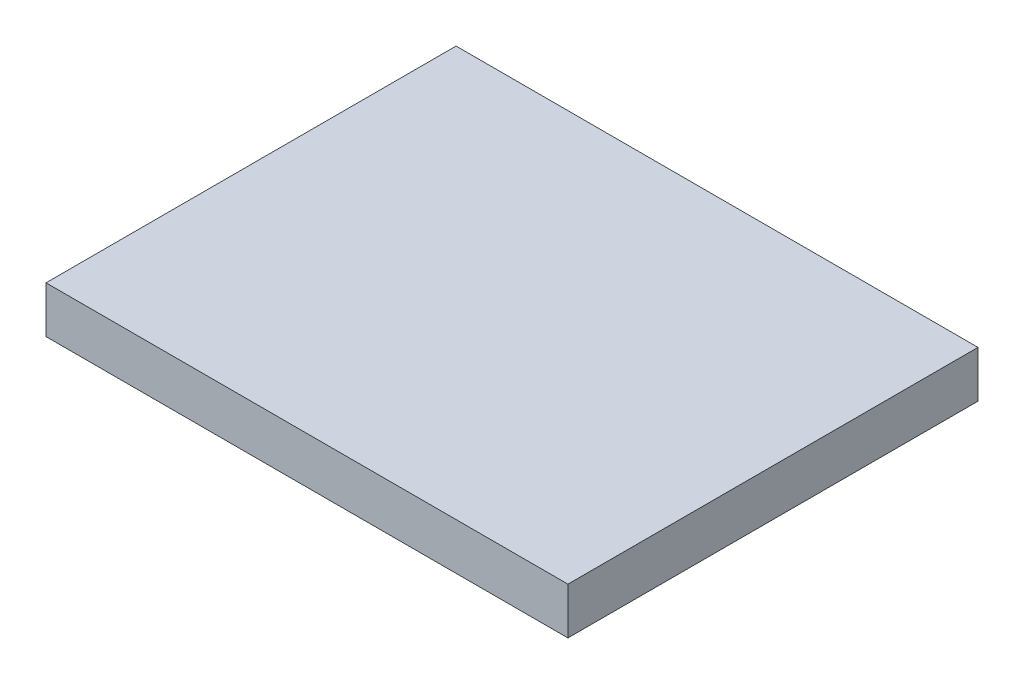
ISO-10303-21;
HEADER;
FILE_DESCRIPTION(('STEP AP214'),'2;1');
FILE_NAME('part.step','',(''),(''),'','','');
FILE_SCHEMA(('AUTOMOTIVE_DESIGN { 1 0 10303 214 1 1 1 1 }'));
ENDSEC;
DATA;
#1=APPLICATION_CONTEXT('core data for automotive mechanical design processes');
#2=APPLICATION_PROTOCOL_DEFINITION('international standard','automotive_design',2000,#1);
#3=PRODUCT_CONTEXT('',#1,'mechanical');
#4=PRODUCT('Part','Part','',(#3));
#5=PRODUCT_RELATED_PRODUCT_CATEGORY('part','',(#4));
#6=PRODUCT_DEFINITION_FORMATION('','',#4);
#7=PRODUCT_DEFINITION_CONTEXT('part definition',#1,'design');
#8=PRODUCT_DEFINITION('design','',#6,#7);
#9=PRODUCT_DEFINITION_SHAPE('','',#8);
#10=(LENGTH_UNIT() NAMED_UNIT(*) SI_UNIT(.MILLI.,.METRE.));
#11=(NAMED_UNIT(*) PLANE_ANGLE_UNIT() SI_UNIT($,.RADIAN.));
#12=(NAMED_UNIT(*) SI_UNIT($,.STERADIAN.) SOLID_ANGLE_UNIT());
#13=UNCERTAINTY_MEASURE_WITH_UNIT(LENGTH_MEASURE(1.E-05),#10,'distance_accuracy_value','');
#14=(GEOMETRIC_REPRESENTATION_CONTEXT(3) GLOBAL_UNCERTAINTY_ASSIGNED_CONTEXT((#13)) GLOBAL_UNIT_ASSIGNED_CONTEXT((#10,
#11,#12)) REPRESENTATION_CONTEXT('',''));
#15=CARTESIAN_POINT('',(0.,0.,0.));
#16=DIRECTION('',(0.,0.,1.));
#17=DIRECTION('',(1.,0.,0.));
#18=AXIS2_PLACEMENT_3D('',#15,#16,#17);
#19=CARTESIAN_POINT('',(0.,1.5875,0.));
#20=DIRECTION('',(1.,0.,0.));
#21=DIRECTION('',(0.,0.,-1.));
#22=AXIS2_PLACEMENT_3D('',#19,#20,#21);
#23=PLANE('',#22);
#24=DIRECTION('',(0.,0.,1.));
#25=VECTOR('',#24,1.);
#26=CARTESIAN_POINT('',(0.,0.,0.));
#27=LINE('',#26,#25);
#28=CARTESIAN_POINT('',(0.,0.,-13.97));
#29=VERTEX_POINT('',#28);
#30=CARTESIAN_POINT('',(0.,0.,0.));
#31=VERTEX_POINT('',#30);
#32=EDGE_CURVE('E96',#29,#31,#27,.T.);
#33=ORIENTED_EDGE('',*,*,#32,.T.);
#34=DIRECTION('',(0.,-1.,0.));
#35=VECTOR('',#34,1.);
#36=CARTESIAN_POINT('',(0.,1.5875,0.));
#37=LINE('',#36,#35);
#38=CARTESIAN_POINT('',(0.,1.5875,0.));
#39=VERTEX_POINT('',#38);
#40=EDGE_CURVE('E11',#39,#31,#37,.T.);
#41=ORIENTED_EDGE('',*,*,#40,.F.);
#42=DIRECTION('',(0.,0.,1.));
#43=VECTOR('',#42,1.);
#44=CARTESIAN_POINT('',(0.,1.5875,0.));
#45=LINE('',#44,#43);
#46=CARTESIAN_POINT('',(0.,1.5875,-13.97));
#47=VERTEX_POINT('',#46);
#48=EDGE_CURVE('E84',#47,#39,#45,.T.);
#49=ORIENTED_EDGE('',*,*,#48,.F.);
#50=DIRECTION('',(0.,-1.,0.));
#51=VECTOR('',#50,1.);
#52=CARTESIAN_POINT('',(0.,1.5875,-13.97));
#53=LINE('',#52,#51);
#54=EDGE_CURVE('E92',#47,#29,#53,.T.);
#55=ORIENTED_EDGE('',*,*,#54,.T.);
#56=EDGE_LOOP('',(#33,#41,#49,#55));
#57=FACE_BOUND('',#56,.T.);
#58=ADVANCED_FACE('F33',(#57),#23,.F.);
#59=CARTESIAN_POINT('',(0.,1.5875,0.));
#60=DIRECTION('',(0.,0.,-1.));
#61=DIRECTION('',(-1.,0.,0.));
#62=AXIS2_PLACEMENT_3D('',#59,#60,#61);
#63=PLANE('',#62);
#64=DIRECTION('',(1.,0.,0.));
#65=VECTOR('',#64,1.);
#66=CARTESIAN_POINT('',(0.,0.,0.));
#67=LINE('',#66,#65);
#68=CARTESIAN_POINT('',(17.78,0.,0.));
#69=VERTEX_POINT('',#68);
#70=EDGE_CURVE('E88',#31,#69,#67,.T.);
#71=ORIENTED_EDGE('',*,*,#70,.T.);
#72=DIRECTION('',(0.,-1.,0.));
#73=VECTOR('',#72,1.);
#74=CARTESIAN_POINT('',(17.78,1.5875,0.));
#75=LINE('',#74,#73);
#76=CARTESIAN_POINT('',(17.78,1.5875,0.));
#77=VERTEX_POINT('',#76);
#78=EDGE_CURVE('E41',#77,#69,#75,.T.);
#79=ORIENTED_EDGE('',*,*,#78,.F.);
#80=DIRECTION('',(1.,0.,0.));
#81=VECTOR('',#80,1.);
#82=CARTESIAN_POINT('',(0.,1.5875,0.));
#83=LINE('',#82,#81);
#84=EDGE_CURVE('E79',#39,#77,#83,.T.);
#85=ORIENTED_EDGE('',*,*,#84,.F.);
#86=ORIENTED_EDGE('',*,*,#40,.T.);
#87=EDGE_LOOP('',(#71,#79,#85,#86));
#88=FACE_BOUND('',#87,.T.);
#89=ADVANCED_FACE('F87',(#88),#63,.F.);
#90=CARTESIAN_POINT('',(17.78,1.5875,0.));
#91=DIRECTION('',(-1.,0.,0.));
#92=DIRECTION('',(0.,0.,1.));
#93=AXIS2_PLACEMENT_3D('',#90,#91,#92);
#94=PLANE('',#93);
#95=DIRECTION('',(0.,0.,-1.));
#96=VECTOR('',#95,1.);
#97=CARTESIAN_POINT('',(17.78,0.,0.));
#98=LINE('',#97,#96);
#99=CARTESIAN_POINT('',(17.78,0.,-13.97));
#100=VERTEX_POINT('',#99);
#101=EDGE_CURVE('E66',#69,#100,#98,.T.);
#102=ORIENTED_EDGE('',*,*,#101,.T.);
#103=DIRECTION('',(0.,-1.,0.));
#104=VECTOR('',#103,1.);
#105=CARTESIAN_POINT('',(17.78,1.5875,-13.97));
#106=LINE('',#105,#104);
#107=CARTESIAN_POINT('',(17.78,1.5875,-13.97));
#108=VERTEX_POINT('',#107);
#109=EDGE_CURVE('E89',#108,#100,#106,.T.);
#110=ORIENTED_EDGE('',*,*,#109,.F.);
#111=DIRECTION('',(0.,0.,-1.));
#112=VECTOR('',#111,1.);
#113=CARTESIAN_POINT('',(17.78,1.5875,0.));
#114=LINE('',#113,#112);
#115=EDGE_CURVE('E82',#77,#108,#114,.T.);
#116=ORIENTED_EDGE('',*,*,#115,.F.);
#117=ORIENTED_EDGE('',*,*,#78,.T.);
#118=EDGE_LOOP('',(#102,#110,#116,#117));
#119=FACE_BOUND('',#118,.T.);
#120=ADVANCED_FACE('F90',(#119),#94,.F.);
#121=CARTESIAN_POINT('',(0.,1.5875,-13.97));
#122=DIRECTION('',(0.,0.,1.));
#123=DIRECTION('',(1.,0.,0.));
#124=AXIS2_PLACEMENT_3D('',#121,#122,#123);
#125=PLANE('',#124);
#126=DIRECTION('',(-1.,0.,0.));
#127=VECTOR('',#126,1.);
#128=CARTESIAN_POINT('',(0.,0.,-13.97));
#129=LINE('',#128,#127);
#130=EDGE_CURVE('E72',#100,#29,#129,.T.);
#131=ORIENTED_EDGE('',*,*,#130,.T.);
#132=ORIENTED_EDGE('',*,*,#54,.F.);
#133=DIRECTION('',(-1.,0.,0.));
#134=VECTOR('',#133,1.);
#135=CARTESIAN_POINT('',(0.,1.5875,-13.97));
#136=LINE('',#135,#134);
#137=EDGE_CURVE('E49',#108,#47,#136,.T.);
#138=ORIENTED_EDGE('',*,*,#137,.F.);
#139=ORIENTED_EDGE('',*,*,#109,.T.);
#140=EDGE_LOOP('',(#131,#132,#138,#139));
#141=FACE_BOUND('',#140,.T.);
#142=ADVANCED_FACE('F103',(#141),#125,.F.);
#143=CARTESIAN_POINT('',(0.,1.5875,0.));
#144=DIRECTION('',(0.,-1.,0.));
#145=DIRECTION('',(0.,0.,-1.));
#146=AXIS2_PLACEMENT_3D('',#143,#144,#145);
#147=PLANE('',#146);
#148=ORIENTED_EDGE('',*,*,#48,.T.);
#149=ORIENTED_EDGE('',*,*,#84,.T.);
#150=ORIENTED_EDGE('',*,*,#115,.T.);
#151=ORIENTED_EDGE('',*,*,#137,.T.);
#152=EDGE_LOOP('',(#148,#149,#150,#151));
#153=FACE_BOUND('',#152,.T.);
#154=ADVANCED_FACE('F80',(#153),#147,.F.);
#155=CARTESIAN_POINT('',(0.,0.,0.));
#156=DIRECTION('',(0.,-1.,0.));
#157=DIRECTION('',(0.,0.,-1.));
#158=AXIS2_PLACEMENT_3D('',#155,#156,#157);
#159=PLANE('',#158);
#160=ORIENTED_EDGE('',*,*,#32,.F.);
#161=ORIENTED_EDGE('',*,*,#130,.F.);
#162=ORIENTED_EDGE('',*,*,#101,.F.);
#163=ORIENTED_EDGE('',*,*,#70,.F.);
#164=EDGE_LOOP('',(#160,#161,#162,#163));
#165=FACE_BOUND('',#164,.T.);
#166=ADVANCED_FACE('F106',(#165),#159,.T.);
#167=CLOSED_SHELL('',(#58,#89,#120,#142,#154,#166));
#168=MANIFOLD_SOLID_BREP('B2',#167);
#169=ADVANCED_BREP_SHAPE_REPRESENTATION('',(#18,#168),#14);
#170=SHAPE_DEFINITION_REPRESENTATION(#9,#169);
ENDSEC;
END-ISO-10303-21;
